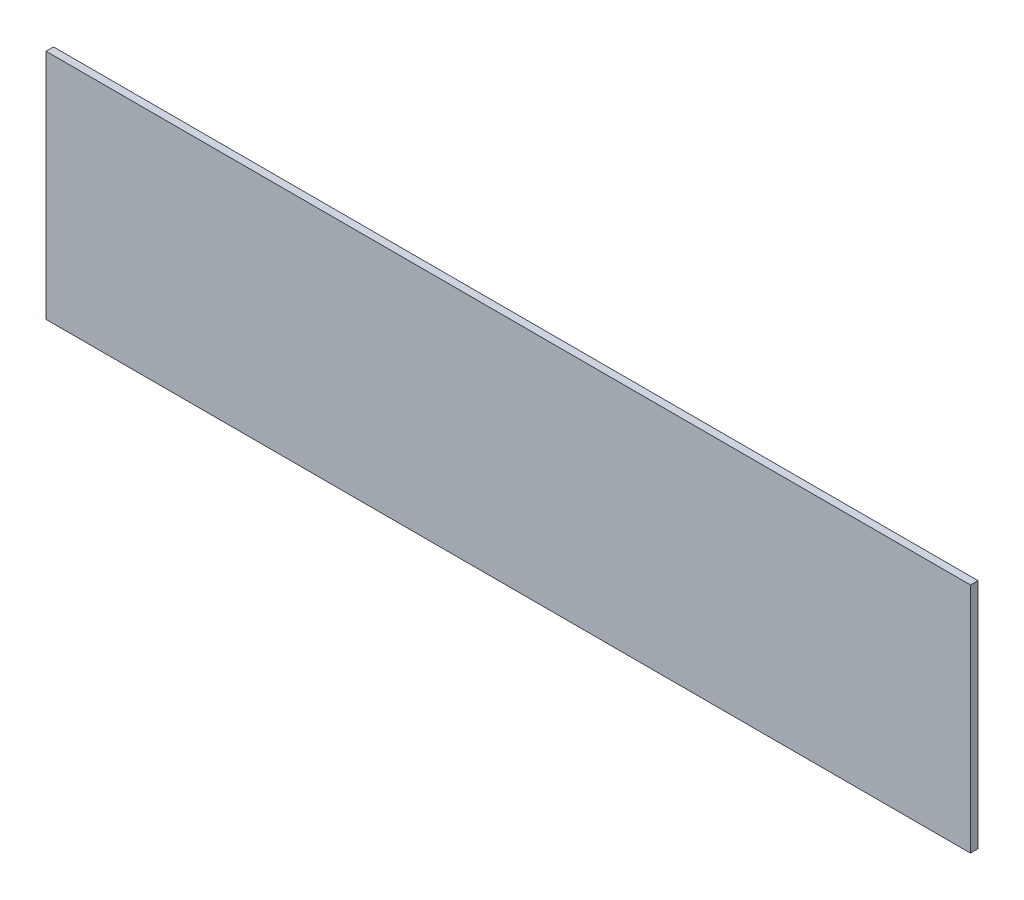
ISO-10303-21;
HEADER;
FILE_DESCRIPTION(('STEP AP214'),'2;1');
FILE_NAME('part.step','',(''),(''),'','','');
FILE_SCHEMA(('AUTOMOTIVE_DESIGN { 1 0 10303 214 1 1 1 1 }'));
ENDSEC;
DATA;
#1=APPLICATION_CONTEXT('core data for automotive mechanical design processes');
#2=APPLICATION_PROTOCOL_DEFINITION('international standard','automotive_design',2000,#1);
#3=PRODUCT_CONTEXT('',#1,'mechanical');
#4=PRODUCT('Part','Part','',(#3));
#5=PRODUCT_RELATED_PRODUCT_CATEGORY('part','',(#4));
#6=PRODUCT_DEFINITION_FORMATION('','',#4);
#7=PRODUCT_DEFINITION_CONTEXT('part definition',#1,'design');
#8=PRODUCT_DEFINITION('design','',#6,#7);
#9=PRODUCT_DEFINITION_SHAPE('','',#8);
#10=(LENGTH_UNIT() NAMED_UNIT(*) SI_UNIT(.MILLI.,.METRE.));
#11=(NAMED_UNIT(*) PLANE_ANGLE_UNIT() SI_UNIT($,.RADIAN.));
#12=(NAMED_UNIT(*) SI_UNIT($,.STERADIAN.) SOLID_ANGLE_UNIT());
#13=UNCERTAINTY_MEASURE_WITH_UNIT(LENGTH_MEASURE(1.E-05),#10,'distance_accuracy_value','');
#14=(GEOMETRIC_REPRESENTATION_CONTEXT(3) GLOBAL_UNCERTAINTY_ASSIGNED_CONTEXT((#13)) GLOBAL_UNIT_ASSIGNED_CONTEXT((#10,
#11,#12)) REPRESENTATION_CONTEXT('',''));
#15=CARTESIAN_POINT('',(0.,0.,0.));
#16=DIRECTION('',(0.,0.,1.));
#17=DIRECTION('',(1.,0.,0.));
#18=AXIS2_PLACEMENT_3D('',#15,#16,#17);
#19=CARTESIAN_POINT('',(1230.,309.,10.));
#20=DIRECTION('',(0.,-1.,0.));
#21=DIRECTION('',(1.,0.,0.));
#22=AXIS2_PLACEMENT_3D('',#19,#20,#21);
#23=PLANE('',#22);
#24=DIRECTION('',(-1.,0.,0.));
#25=VECTOR('',#24,1.);
#26=CARTESIAN_POINT('',(1230.,309.,0.));
#27=LINE('',#26,#25);
#28=CARTESIAN_POINT('',(1230.,309.,0.));
#29=VERTEX_POINT('',#28);
#30=CARTESIAN_POINT('',(0.,309.,0.));
#31=VERTEX_POINT('',#30);
#32=EDGE_CURVE('E107',#29,#31,#27,.T.);
#33=ORIENTED_EDGE('',*,*,#32,.T.);
#34=DIRECTION('',(0.,0.,-1.));
#35=VECTOR('',#34,1.);
#36=CARTESIAN_POINT('',(0.,309.,10.));
#37=LINE('',#36,#35);
#38=CARTESIAN_POINT('',(0.,309.,10.));
#39=VERTEX_POINT('',#38);
#40=EDGE_CURVE('E11',#39,#31,#37,.T.);
#41=ORIENTED_EDGE('',*,*,#40,.F.);
#42=DIRECTION('',(-1.,0.,0.));
#43=VECTOR('',#42,1.);
#44=CARTESIAN_POINT('',(1230.,309.,10.));
#45=LINE('',#44,#43);
#46=CARTESIAN_POINT('',(1230.,309.,10.));
#47=VERTEX_POINT('',#46);
#48=EDGE_CURVE('E91',#47,#39,#45,.T.);
#49=ORIENTED_EDGE('',*,*,#48,.F.);
#50=DIRECTION('',(0.,0.,-1.));
#51=VECTOR('',#50,1.);
#52=CARTESIAN_POINT('',(1230.,309.,10.));
#53=LINE('',#52,#51);
#54=EDGE_CURVE('E103',#47,#29,#53,.T.);
#55=ORIENTED_EDGE('',*,*,#54,.T.);
#56=EDGE_LOOP('',(#33,#41,#49,#55));
#57=FACE_BOUND('',#56,.T.);
#58=ADVANCED_FACE('F39',(#57),#23,.F.);
#59=CARTESIAN_POINT('',(0.,309.,10.));
#60=DIRECTION('',(1.,0.,0.));
#61=DIRECTION('',(0.,1.,0.));
#62=AXIS2_PLACEMENT_3D('',#59,#60,#61);
#63=PLANE('',#62);
#64=DIRECTION('',(0.,-1.,0.));
#65=VECTOR('',#64,1.);
#66=CARTESIAN_POINT('',(0.,309.,0.));
#67=LINE('',#66,#65);
#68=CARTESIAN_POINT('',(0.,0.,0.));
#69=VERTEX_POINT('',#68);
#70=EDGE_CURVE('E96',#31,#69,#67,.T.);
#71=ORIENTED_EDGE('',*,*,#70,.T.);
#72=DIRECTION('',(0.,0.,-1.));
#73=VECTOR('',#72,1.);
#74=CARTESIAN_POINT('',(0.,0.,10.));
#75=LINE('',#74,#73);
#76=CARTESIAN_POINT('',(0.,0.,10.));
#77=VERTEX_POINT('',#76);
#78=EDGE_CURVE('E48',#77,#69,#75,.T.);
#79=ORIENTED_EDGE('',*,*,#78,.F.);
#80=DIRECTION('',(0.,-1.,0.));
#81=VECTOR('',#80,1.);
#82=CARTESIAN_POINT('',(0.,309.,10.));
#83=LINE('',#82,#81);
#84=EDGE_CURVE('E86',#39,#77,#83,.T.);
#85=ORIENTED_EDGE('',*,*,#84,.F.);
#86=ORIENTED_EDGE('',*,*,#40,.T.);
#87=EDGE_LOOP('',(#71,#79,#85,#86));
#88=FACE_BOUND('',#87,.T.);
#89=ADVANCED_FACE('F95',(#88),#63,.F.);
#90=CARTESIAN_POINT('',(1230.,0.,10.));
#91=DIRECTION('',(0.,1.,0.));
#92=DIRECTION('',(-1.,0.,0.));
#93=AXIS2_PLACEMENT_3D('',#90,#91,#92);
#94=PLANE('',#93);
#95=DIRECTION('',(1.,0.,0.));
#96=VECTOR('',#95,1.);
#97=CARTESIAN_POINT('',(1230.,0.,0.));
#98=LINE('',#97,#96);
#99=CARTESIAN_POINT('',(1230.,0.,0.));
#100=VERTEX_POINT('',#99);
#101=EDGE_CURVE('E73',#69,#100,#98,.T.);
#102=ORIENTED_EDGE('',*,*,#101,.T.);
#103=DIRECTION('',(0.,0.,-1.));
#104=VECTOR('',#103,1.);
#105=CARTESIAN_POINT('',(1230.,0.,10.));
#106=LINE('',#105,#104);
#107=CARTESIAN_POINT('',(1230.,0.,10.));
#108=VERTEX_POINT('',#107);
#109=EDGE_CURVE('E98',#108,#100,#106,.T.);
#110=ORIENTED_EDGE('',*,*,#109,.F.);
#111=DIRECTION('',(1.,0.,0.));
#112=VECTOR('',#111,1.);
#113=CARTESIAN_POINT('',(1230.,0.,10.));
#114=LINE('',#113,#112);
#115=EDGE_CURVE('E89',#77,#108,#114,.T.);
#116=ORIENTED_EDGE('',*,*,#115,.F.);
#117=ORIENTED_EDGE('',*,*,#78,.T.);
#118=EDGE_LOOP('',(#102,#110,#116,#117));
#119=FACE_BOUND('',#118,.T.);
#120=ADVANCED_FACE('F99',(#119),#94,.F.);
#121=CARTESIAN_POINT('',(1230.,309.,10.));
#122=DIRECTION('',(-1.,0.,0.));
#123=DIRECTION('',(0.,0.,1.));
#124=AXIS2_PLACEMENT_3D('',#121,#122,#123);
#125=PLANE('',#124);
#126=DIRECTION('',(0.,1.,0.));
#127=VECTOR('',#126,1.);
#128=CARTESIAN_POINT('',(1230.,309.,0.));
#129=LINE('',#128,#127);
#130=EDGE_CURVE('E79',#100,#29,#129,.T.);
#131=ORIENTED_EDGE('',*,*,#130,.T.);
#132=ORIENTED_EDGE('',*,*,#54,.F.);
#133=DIRECTION('',(0.,1.,0.));
#134=VECTOR('',#133,1.);
#135=CARTESIAN_POINT('',(1230.,309.,10.));
#136=LINE('',#135,#134);
#137=EDGE_CURVE('E56',#108,#47,#136,.T.);
#138=ORIENTED_EDGE('',*,*,#137,.F.);
#139=ORIENTED_EDGE('',*,*,#109,.T.);
#140=EDGE_LOOP('',(#131,#132,#138,#139));
#141=FACE_BOUND('',#140,.T.);
#142=ADVANCED_FACE('F120',(#141),#125,.F.);
#143=CARTESIAN_POINT('',(0.,0.,10.));
#144=DIRECTION('',(0.,0.,1.));
#145=DIRECTION('',(1.,0.,0.));
#146=AXIS2_PLACEMENT_3D('',#143,#144,#145);
#147=PLANE('',#146);
#148=ORIENTED_EDGE('',*,*,#48,.T.);
#149=ORIENTED_EDGE('',*,*,#84,.T.);
#150=ORIENTED_EDGE('',*,*,#115,.T.);
#151=ORIENTED_EDGE('',*,*,#137,.T.);
#152=EDGE_LOOP('',(#148,#149,#150,#151));
#153=FACE_BOUND('',#152,.T.);
#154=ADVANCED_FACE('F87',(#153),#147,.T.);
#155=CARTESIAN_POINT('',(0.,0.,0.));
#156=DIRECTION('',(0.,0.,1.));
#157=DIRECTION('',(1.,0.,0.));
#158=AXIS2_PLACEMENT_3D('',#155,#156,#157);
#159=PLANE('',#158);
#160=ORIENTED_EDGE('',*,*,#32,.F.);
#161=ORIENTED_EDGE('',*,*,#130,.F.);
#162=ORIENTED_EDGE('',*,*,#101,.F.);
#163=ORIENTED_EDGE('',*,*,#70,.F.);
#164=EDGE_LOOP('',(#160,#161,#162,#163));
#165=FACE_BOUND('',#164,.T.);
#166=ADVANCED_FACE('F123',(#165),#159,.F.);
#167=CLOSED_SHELL('',(#58,#89,#120,#142,#154,#166));
#168=MANIFOLD_SOLID_BREP('B2',#167);
#169=ADVANCED_BREP_SHAPE_REPRESENTATION('',(#18,#168),#14);
#170=SHAPE_DEFINITION_REPRESENTATION(#9,#169);
ENDSEC;
END-ISO-10303-21;
